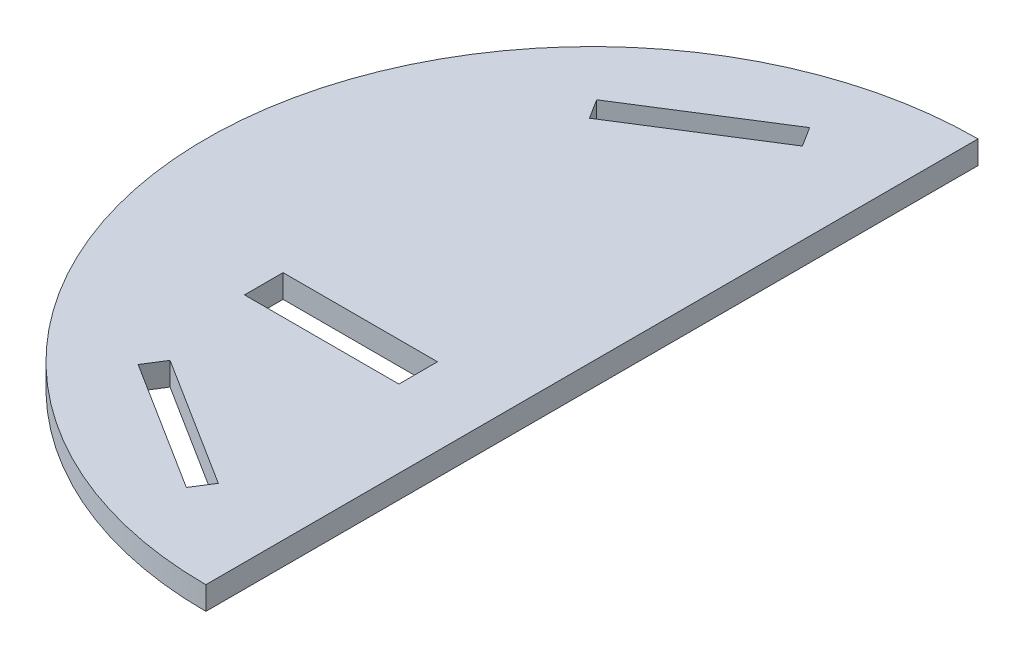
ISO-10303-21;
HEADER;
FILE_DESCRIPTION(('STEP AP214'),'2;1');
FILE_NAME('part.step','',(''),(''),'','','');
FILE_SCHEMA(('AUTOMOTIVE_DESIGN { 1 0 10303 214 1 1 1 1 }'));
ENDSEC;
DATA;
#1=APPLICATION_CONTEXT('core data for automotive mechanical design processes');
#2=APPLICATION_PROTOCOL_DEFINITION('international standard','automotive_design',2000,#1);
#3=PRODUCT_CONTEXT('',#1,'mechanical');
#4=PRODUCT('Part','Part','',(#3));
#5=PRODUCT_RELATED_PRODUCT_CATEGORY('part','',(#4));
#6=PRODUCT_DEFINITION_FORMATION('','',#4);
#7=PRODUCT_DEFINITION_CONTEXT('part definition',#1,'design');
#8=PRODUCT_DEFINITION('design','',#6,#7);
#9=PRODUCT_DEFINITION_SHAPE('','',#8);
#10=(LENGTH_UNIT() NAMED_UNIT(*) SI_UNIT(.MILLI.,.METRE.));
#11=(NAMED_UNIT(*) PLANE_ANGLE_UNIT() SI_UNIT($,.RADIAN.));
#12=(NAMED_UNIT(*) SI_UNIT($,.STERADIAN.) SOLID_ANGLE_UNIT());
#13=UNCERTAINTY_MEASURE_WITH_UNIT(LENGTH_MEASURE(1.E-05),#10,'distance_accuracy_value','');
#14=(GEOMETRIC_REPRESENTATION_CONTEXT(3) GLOBAL_UNCERTAINTY_ASSIGNED_CONTEXT((#13)) GLOBAL_UNIT_ASSIGNED_CONTEXT((#10,
#11,#12)) REPRESENTATION_CONTEXT('',''));
#15=CARTESIAN_POINT('',(0.,0.,0.));
#16=DIRECTION('',(0.,0.,1.));
#17=DIRECTION('',(1.,0.,0.));
#18=AXIS2_PLACEMENT_3D('',#15,#16,#17);
#19=CARTESIAN_POINT('',(0.,3.,0.));
#20=DIRECTION('',(0.,1.,0.));
#21=DIRECTION('',(0.,0.,1.));
#22=AXIS2_PLACEMENT_3D('',#19,#20,#21);
#23=PLANE('',#22);
#24=DIRECTION('',(0.845831324968348,0.,-0.533450437906175));
#25=VECTOR('',#24,1.);
#26=CARTESIAN_POINT('',(-20.0725494227989,3.,-31.826745030744));
#27=LINE('',#26,#25);
#28=CARTESIAN_POINT('',(-27.4795706485014,3.,-27.1552714168066));
#29=VERTEX_POINT('',#28);
#30=CARTESIAN_POINT('',(-10.5629441491344,3.,-37.8242801749302));
#31=VERTEX_POINT('',#30);
#32=EDGE_CURVE('E167',#29,#31,#27,.T.);
#33=ORIENTED_EDGE('',*,*,#32,.F.);
#34=DIRECTION('',(0.533450437906175,0.,0.845831324968348));
#35=VECTOR('',#34,1.);
#36=CARTESIAN_POINT('',(-7.40702122570254,3.,4.67147361393741));
#37=LINE('',#36,#35);
#38=CARTESIAN_POINT('',(-29.0799219622199,3.,-29.6927653917117));
#39=VERTEX_POINT('',#38);
#40=EDGE_CURVE('E176',#39,#29,#37,.T.);
#41=ORIENTED_EDGE('',*,*,#40,.F.);
#42=DIRECTION('',(0.845831324968348,0.,-0.533450437906175));
#43=VECTOR('',#42,1.);
#44=CARTESIAN_POINT('',(-21.6729007365174,3.,-34.3642390056491));
#45=LINE('',#44,#43);
#46=CARTESIAN_POINT('',(-12.163295462853,3.,-40.3617741498352));
#47=VERTEX_POINT('',#46);
#48=EDGE_CURVE('E173',#39,#47,#45,.T.);
#49=ORIENTED_EDGE('',*,*,#48,.T.);
#50=DIRECTION('',(-0.533450437906175,0.,-0.845831324968347));
#51=VECTOR('',#50,1.);
#52=CARTESIAN_POINT('',(9.50960527366441,3.,-5.9975351441861));
#53=LINE('',#52,#51);
#54=EDGE_CURVE('E169',#31,#47,#53,.T.);
#55=ORIENTED_EDGE('',*,*,#54,.F.);
#56=EDGE_LOOP('',(#33,#41,#49,#55));
#57=FACE_BOUND('',#56,.T.);
#58=DIRECTION('',(0.,0.,1.));
#59=VECTOR('',#58,1.);
#60=CARTESIAN_POINT('',(0.,3.,-50.));
#61=LINE('',#60,#59);
#62=CARTESIAN_POINT('',(0.,3.,-50.));
#63=VERTEX_POINT('',#62);
#64=CARTESIAN_POINT('',(0.,3.,50.));
#65=VERTEX_POINT('',#64);
#66=EDGE_CURVE('E208',#63,#65,#61,.T.);
#67=ORIENTED_EDGE('',*,*,#66,.F.);
#68=CARTESIAN_POINT('',(0.,3.,0.));
#69=DIRECTION('',(0.,1.,0.));
#70=DIRECTION('',(0.,0.,1.));
#71=AXIS2_PLACEMENT_3D('',#68,#69,#70);
#72=CIRCLE('',#71,50.);
#73=EDGE_CURVE('E211',#63,#65,#72,.T.);
#74=ORIENTED_EDGE('',*,*,#73,.T.);
#75=EDGE_LOOP('',(#67,#74));
#76=FACE_BOUND('',#75,.T.);
#77=DIRECTION('',(0.845831324968348,0.,0.533450437906175));
#78=VECTOR('',#77,1.);
#79=CARTESIAN_POINT('',(-21.6729007365174,3.,34.3642390056491));
#80=LINE('',#79,#78);
#81=CARTESIAN_POINT('',(-29.0799219622199,3.,29.6927653917117));
#82=VERTEX_POINT('',#81);
#83=CARTESIAN_POINT('',(-12.163295462853,3.,40.3617741498352));
#84=VERTEX_POINT('',#83);
#85=EDGE_CURVE('E191',#82,#84,#80,.T.);
#86=ORIENTED_EDGE('',*,*,#85,.F.);
#87=DIRECTION('',(0.533450437906175,0.,-0.845831324968348));
#88=VECTOR('',#87,1.);
#89=CARTESIAN_POINT('',(-7.40702122570255,3.,-4.67147361393741));
#90=LINE('',#89,#88);
#91=CARTESIAN_POINT('',(-27.4795706485014,3.,27.1552714168066));
#92=VERTEX_POINT('',#91);
#93=EDGE_CURVE('E164',#82,#92,#90,.T.);
#94=ORIENTED_EDGE('',*,*,#93,.T.);
#95=DIRECTION('',(0.845831324968347,0.,0.533450437906175));
#96=VECTOR('',#95,1.);
#97=CARTESIAN_POINT('',(-20.0725494227989,3.,31.826745030744));
#98=LINE('',#97,#96);
#99=CARTESIAN_POINT('',(-10.5629441491344,3.,37.8242801749301));
#100=VERTEX_POINT('',#99);
#101=EDGE_CURVE('E197',#92,#100,#98,.T.);
#102=ORIENTED_EDGE('',*,*,#101,.T.);
#103=DIRECTION('',(-0.533450437906175,0.,0.845831324968347));
#104=VECTOR('',#103,1.);
#105=CARTESIAN_POINT('',(9.50960527366441,3.,5.99753514418609));
#106=LINE('',#105,#104);
#107=EDGE_CURVE('E194',#100,#84,#106,.T.);
#108=ORIENTED_EDGE('',*,*,#107,.T.);
#109=EDGE_LOOP('',(#86,#94,#102,#108));
#110=FACE_BOUND('',#109,.T.);
#111=DIRECTION('',(0.,0.,1.));
#112=VECTOR('',#111,1.);
#113=CARTESIAN_POINT('',(-30.,3.,0.));
#114=LINE('',#113,#112);
#115=CARTESIAN_POINT('',(-30.,3.,10.));
#116=VERTEX_POINT('',#115);
#117=CARTESIAN_POINT('',(-30.,3.,15.));
#118=VERTEX_POINT('',#117);
#119=EDGE_CURVE('E152',#116,#118,#114,.T.);
#120=ORIENTED_EDGE('',*,*,#119,.F.);
#121=DIRECTION('',(1.,0.,0.));
#122=VECTOR('',#121,1.);
#123=CARTESIAN_POINT('',(0.,3.,10.));
#124=LINE('',#123,#122);
#125=CARTESIAN_POINT('',(-10.,3.,10.));
#126=VERTEX_POINT('',#125);
#127=EDGE_CURVE('E55',#116,#126,#124,.T.);
#128=ORIENTED_EDGE('',*,*,#127,.T.);
#129=DIRECTION('',(0.,0.,-1.));
#130=VECTOR('',#129,1.);
#131=CARTESIAN_POINT('',(-10.,3.,0.));
#132=LINE('',#131,#130);
#133=CARTESIAN_POINT('',(-10.,3.,15.));
#134=VERTEX_POINT('',#133);
#135=EDGE_CURVE('E157',#134,#126,#132,.T.);
#136=ORIENTED_EDGE('',*,*,#135,.F.);
#137=DIRECTION('',(1.,0.,0.));
#138=VECTOR('',#137,1.);
#139=CARTESIAN_POINT('',(0.,3.,15.));
#140=LINE('',#139,#138);
#141=EDGE_CURVE('E143',#118,#134,#140,.T.);
#142=ORIENTED_EDGE('',*,*,#141,.F.);
#143=EDGE_LOOP('',(#120,#128,#136,#142));
#144=FACE_BOUND('',#143,.T.);
#145=ADVANCED_FACE('F40',(#57,#76,#110,#144),#23,.T.);
#146=CARTESIAN_POINT('',(0.,0.,0.));
#147=DIRECTION('',(0.,1.,0.));
#148=DIRECTION('',(0.,0.,1.));
#149=AXIS2_PLACEMENT_3D('',#146,#147,#148);
#150=PLANE('',#149);
#151=DIRECTION('',(0.533450437906175,0.,-0.845831324968348));
#152=VECTOR('',#151,1.);
#153=CARTESIAN_POINT('',(-7.40702122570255,0.,-4.67147361393742));
#154=LINE('',#153,#152);
#155=CARTESIAN_POINT('',(-29.0799219622199,0.,29.6927653917117));
#156=VERTEX_POINT('',#155);
#157=CARTESIAN_POINT('',(-27.4795706485014,0.,27.1552714168066));
#158=VERTEX_POINT('',#157);
#159=EDGE_CURVE('E230',#156,#158,#154,.T.);
#160=ORIENTED_EDGE('',*,*,#159,.F.);
#161=DIRECTION('',(0.845831324968347,0.,0.533450437906175));
#162=VECTOR('',#161,1.);
#163=CARTESIAN_POINT('',(-21.6729007365174,0.,34.3642390056491));
#164=LINE('',#163,#162);
#165=CARTESIAN_POINT('',(-12.163295462853,0.,40.3617741498352));
#166=VERTEX_POINT('',#165);
#167=EDGE_CURVE('E221',#156,#166,#164,.T.);
#168=ORIENTED_EDGE('',*,*,#167,.T.);
#169=DIRECTION('',(-0.533450437906175,0.,0.845831324968347));
#170=VECTOR('',#169,1.);
#171=CARTESIAN_POINT('',(9.50960527366441,0.,5.99753514418609));
#172=LINE('',#171,#170);
#173=CARTESIAN_POINT('',(-10.5629441491344,0.,37.8242801749301));
#174=VERTEX_POINT('',#173);
#175=EDGE_CURVE('E225',#174,#166,#172,.T.);
#176=ORIENTED_EDGE('',*,*,#175,.F.);
#177=DIRECTION('',(0.845831324968347,0.,0.533450437906175));
#178=VECTOR('',#177,1.);
#179=CARTESIAN_POINT('',(-20.0725494227989,0.,31.826745030744));
#180=LINE('',#179,#178);
#181=EDGE_CURVE('E228',#158,#174,#180,.T.);
#182=ORIENTED_EDGE('',*,*,#181,.F.);
#183=EDGE_LOOP('',(#160,#168,#176,#182));
#184=FACE_BOUND('',#183,.T.);
#185=DIRECTION('',(0.,0.,1.));
#186=VECTOR('',#185,1.);
#187=CARTESIAN_POINT('',(0.,0.,-50.));
#188=LINE('',#187,#186);
#189=CARTESIAN_POINT('',(0.,0.,-50.));
#190=VERTEX_POINT('',#189);
#191=CARTESIAN_POINT('',(0.,0.,50.));
#192=VERTEX_POINT('',#191);
#193=EDGE_CURVE('E182',#190,#192,#188,.T.);
#194=ORIENTED_EDGE('',*,*,#193,.T.);
#195=CARTESIAN_POINT('',(0.,0.,0.));
#196=DIRECTION('',(0.,1.,0.));
#197=DIRECTION('',(0.,0.,1.));
#198=AXIS2_PLACEMENT_3D('',#195,#196,#197);
#199=CIRCLE('',#198,50.);
#200=EDGE_CURVE('E212',#190,#192,#199,.T.);
#201=ORIENTED_EDGE('',*,*,#200,.F.);
#202=EDGE_LOOP('',(#194,#201));
#203=FACE_BOUND('',#202,.T.);
#204=DIRECTION('',(0.533450437906175,0.,0.845831324968348));
#205=VECTOR('',#204,1.);
#206=CARTESIAN_POINT('',(-7.40702122570254,0.,4.67147361393742));
#207=LINE('',#206,#205);
#208=CARTESIAN_POINT('',(-29.0799219622199,0.,-29.6927653917117));
#209=VERTEX_POINT('',#208);
#210=CARTESIAN_POINT('',(-27.4795706485014,0.,-27.1552714168066));
#211=VERTEX_POINT('',#210);
#212=EDGE_CURVE('E238',#209,#211,#207,.T.);
#213=ORIENTED_EDGE('',*,*,#212,.T.);
#214=DIRECTION('',(0.845831324968347,0.,-0.533450437906175));
#215=VECTOR('',#214,1.);
#216=CARTESIAN_POINT('',(-20.0725494227989,0.,-31.8267450307441));
#217=LINE('',#216,#215);
#218=CARTESIAN_POINT('',(-10.5629441491344,0.,-37.8242801749302));
#219=VERTEX_POINT('',#218);
#220=EDGE_CURVE('E241',#211,#219,#217,.T.);
#221=ORIENTED_EDGE('',*,*,#220,.T.);
#222=DIRECTION('',(-0.533450437906175,0.,-0.845831324968347));
#223=VECTOR('',#222,1.);
#224=CARTESIAN_POINT('',(9.50960527366442,0.,-5.99753514418609));
#225=LINE('',#224,#223);
#226=CARTESIAN_POINT('',(-12.163295462853,0.,-40.3617741498352));
#227=VERTEX_POINT('',#226);
#228=EDGE_CURVE('E232',#219,#227,#225,.T.);
#229=ORIENTED_EDGE('',*,*,#228,.T.);
#230=DIRECTION('',(0.845831324968348,0.,-0.533450437906175));
#231=VECTOR('',#230,1.);
#232=CARTESIAN_POINT('',(-21.6729007365173,0.,-34.3642390056491));
#233=LINE('',#232,#231);
#234=EDGE_CURVE('E235',#209,#227,#233,.T.);
#235=ORIENTED_EDGE('',*,*,#234,.F.);
#236=EDGE_LOOP('',(#213,#221,#229,#235));
#237=FACE_BOUND('',#236,.T.);
#238=DIRECTION('',(1.,0.,0.));
#239=VECTOR('',#238,1.);
#240=CARTESIAN_POINT('',(0.,0.,10.));
#241=LINE('',#240,#239);
#242=CARTESIAN_POINT('',(-30.,0.,10.));
#243=VERTEX_POINT('',#242);
#244=CARTESIAN_POINT('',(-10.,0.,10.));
#245=VERTEX_POINT('',#244);
#246=EDGE_CURVE('E11',#243,#245,#241,.T.);
#247=ORIENTED_EDGE('',*,*,#246,.F.);
#248=DIRECTION('',(0.,0.,1.));
#249=VECTOR('',#248,1.);
#250=CARTESIAN_POINT('',(-30.,0.,0.));
#251=LINE('',#250,#249);
#252=CARTESIAN_POINT('',(-30.,0.,15.));
#253=VERTEX_POINT('',#252);
#254=EDGE_CURVE('E244',#243,#253,#251,.T.);
#255=ORIENTED_EDGE('',*,*,#254,.T.);
#256=DIRECTION('',(1.,0.,0.));
#257=VECTOR('',#256,1.);
#258=CARTESIAN_POINT('',(0.,0.,15.));
#259=LINE('',#258,#257);
#260=CARTESIAN_POINT('',(-10.,0.,15.));
#261=VERTEX_POINT('',#260);
#262=EDGE_CURVE('E146',#253,#261,#259,.T.);
#263=ORIENTED_EDGE('',*,*,#262,.T.);
#264=DIRECTION('',(0.,0.,-1.));
#265=VECTOR('',#264,1.);
#266=CARTESIAN_POINT('',(-10.,0.,0.));
#267=LINE('',#266,#265);
#268=EDGE_CURVE('E48',#261,#245,#267,.T.);
#269=ORIENTED_EDGE('',*,*,#268,.T.);
#270=EDGE_LOOP('',(#247,#255,#263,#269));
#271=FACE_BOUND('',#270,.T.);
#272=ADVANCED_FACE('F249',(#184,#203,#237,#271),#150,.F.);
#273=CARTESIAN_POINT('',(0.,3.,-50.));
#274=DIRECTION('',(1.,0.,0.));
#275=DIRECTION('',(0.,0.,-1.));
#276=AXIS2_PLACEMENT_3D('',#273,#274,#275);
#277=PLANE('',#276);
#278=ORIENTED_EDGE('',*,*,#193,.F.);
#279=DIRECTION('',(0.,-1.,0.));
#280=VECTOR('',#279,1.);
#281=CARTESIAN_POINT('',(0.,3.,-50.));
#282=LINE('',#281,#280);
#283=EDGE_CURVE('E219',#63,#190,#282,.T.);
#284=ORIENTED_EDGE('',*,*,#283,.F.);
#285=ORIENTED_EDGE('',*,*,#66,.T.);
#286=DIRECTION('',(0.,-1.,0.));
#287=VECTOR('',#286,1.);
#288=CARTESIAN_POINT('',(0.,3.,50.));
#289=LINE('',#288,#287);
#290=EDGE_CURVE('E214',#65,#192,#289,.T.);
#291=ORIENTED_EDGE('',*,*,#290,.T.);
#292=EDGE_LOOP('',(#278,#284,#285,#291));
#293=FACE_BOUND('',#292,.T.);
#294=ADVANCED_FACE('F42',(#293),#277,.T.);
#295=CARTESIAN_POINT('',(0.,3.,0.));
#296=DIRECTION('',(0.,-1.,0.));
#297=DIRECTION('',(0.,0.,-1.));
#298=AXIS2_PLACEMENT_3D('',#295,#296,#297);
#299=CYLINDRICAL_SURFACE('',#298,50.);
#300=ORIENTED_EDGE('',*,*,#200,.T.);
#301=ORIENTED_EDGE('',*,*,#290,.F.);
#302=ORIENTED_EDGE('',*,*,#73,.F.);
#303=ORIENTED_EDGE('',*,*,#283,.T.);
#304=EDGE_LOOP('',(#300,#301,#302,#303));
#305=FACE_BOUND('',#304,.T.);
#306=ADVANCED_FACE('F281',(#305),#299,.T.);
#307=CARTESIAN_POINT('',(-7.40702122570255,-2.,-4.67147361393741));
#308=DIRECTION('',(0.845831324968348,0.,0.533450437906175));
#309=DIRECTION('',(0.533450437906175,0.,-0.845831324968348));
#310=AXIS2_PLACEMENT_3D('',#307,#308,#309);
#311=PLANE('',#310);
#312=ORIENTED_EDGE('',*,*,#159,.T.);
#313=DIRECTION('',(0.,1.,0.));
#314=VECTOR('',#313,1.);
#315=CARTESIAN_POINT('',(-27.4795706485014,-2.,27.1552714168066));
#316=LINE('',#315,#314);
#317=EDGE_CURVE('E170',#158,#92,#316,.T.);
#318=ORIENTED_EDGE('',*,*,#317,.T.);
#319=ORIENTED_EDGE('',*,*,#93,.F.);
#320=DIRECTION('',(0.,1.,0.));
#321=VECTOR('',#320,1.);
#322=CARTESIAN_POINT('',(-29.0799219622199,-2.,29.6927653917117));
#323=LINE('',#322,#321);
#324=EDGE_CURVE('E200',#156,#82,#323,.T.);
#325=ORIENTED_EDGE('',*,*,#324,.F.);
#326=EDGE_LOOP('',(#312,#318,#319,#325));
#327=FACE_BOUND('',#326,.T.);
#328=ADVANCED_FACE('F279',(#327),#311,.T.);
#329=CARTESIAN_POINT('',(-20.0725494227989,-2.,31.826745030744));
#330=DIRECTION('',(-0.533450437906175,0.,0.845831324968347));
#331=DIRECTION('',(0.845831324968347,0.,0.533450437906175));
#332=AXIS2_PLACEMENT_3D('',#329,#330,#331);
#333=PLANE('',#332);
#334=ORIENTED_EDGE('',*,*,#181,.T.);
#335=DIRECTION('',(0.,1.,0.));
#336=VECTOR('',#335,1.);
#337=CARTESIAN_POINT('',(-10.5629441491344,-2.,37.8242801749301));
#338=LINE('',#337,#336);
#339=EDGE_CURVE('E202',#174,#100,#338,.T.);
#340=ORIENTED_EDGE('',*,*,#339,.T.);
#341=ORIENTED_EDGE('',*,*,#101,.F.);
#342=ORIENTED_EDGE('',*,*,#317,.F.);
#343=EDGE_LOOP('',(#334,#340,#341,#342));
#344=FACE_BOUND('',#343,.T.);
#345=ADVANCED_FACE('F289',(#344),#333,.T.);
#346=CARTESIAN_POINT('',(9.50960527366441,-2.,5.99753514418609));
#347=DIRECTION('',(-0.845831324968347,0.,-0.533450437906175));
#348=DIRECTION('',(-0.533450437906175,0.,0.845831324968347));
#349=AXIS2_PLACEMENT_3D('',#346,#347,#348);
#350=PLANE('',#349);
#351=ORIENTED_EDGE('',*,*,#175,.T.);
#352=DIRECTION('',(0.,1.,0.));
#353=VECTOR('',#352,1.);
#354=CARTESIAN_POINT('',(-12.163295462853,-2.,40.3617741498352));
#355=LINE('',#354,#353);
#356=EDGE_CURVE('E204',#166,#84,#355,.T.);
#357=ORIENTED_EDGE('',*,*,#356,.T.);
#358=ORIENTED_EDGE('',*,*,#107,.F.);
#359=ORIENTED_EDGE('',*,*,#339,.F.);
#360=EDGE_LOOP('',(#351,#357,#358,#359));
#361=FACE_BOUND('',#360,.T.);
#362=ADVANCED_FACE('F313',(#361),#350,.T.);
#363=CARTESIAN_POINT('',(-21.6729007365174,-2.,34.3642390056491));
#364=DIRECTION('',(-0.533450437906175,0.,0.845831324968347));
#365=DIRECTION('',(0.845831324968347,0.,0.533450437906175));
#366=AXIS2_PLACEMENT_3D('',#363,#364,#365);
#367=PLANE('',#366);
#368=ORIENTED_EDGE('',*,*,#324,.T.);
#369=ORIENTED_EDGE('',*,*,#85,.T.);
#370=ORIENTED_EDGE('',*,*,#356,.F.);
#371=ORIENTED_EDGE('',*,*,#167,.F.);
#372=EDGE_LOOP('',(#368,#369,#370,#371));
#373=FACE_BOUND('',#372,.T.);
#374=ADVANCED_FACE('F303',(#373),#367,.F.);
#375=CARTESIAN_POINT('',(-20.0725494227989,-2.,-31.826745030744));
#376=DIRECTION('',(0.533450437906175,0.,0.845831324968347));
#377=DIRECTION('',(0.845831324968347,0.,-0.533450437906175));
#378=AXIS2_PLACEMENT_3D('',#375,#376,#377);
#379=PLANE('',#378);
#380=DIRECTION('',(0.,1.,0.));
#381=VECTOR('',#380,1.);
#382=CARTESIAN_POINT('',(-27.4795706485014,-2.,-27.1552714168066));
#383=LINE('',#382,#381);
#384=EDGE_CURVE('E180',#211,#29,#383,.T.);
#385=ORIENTED_EDGE('',*,*,#384,.T.);
#386=ORIENTED_EDGE('',*,*,#32,.T.);
#387=DIRECTION('',(0.,1.,0.));
#388=VECTOR('',#387,1.);
#389=CARTESIAN_POINT('',(-10.5629441491344,-2.,-37.8242801749302));
#390=LINE('',#389,#388);
#391=EDGE_CURVE('E179',#219,#31,#390,.T.);
#392=ORIENTED_EDGE('',*,*,#391,.F.);
#393=ORIENTED_EDGE('',*,*,#220,.F.);
#394=EDGE_LOOP('',(#385,#386,#392,#393));
#395=FACE_BOUND('',#394,.T.);
#396=ADVANCED_FACE('F320',(#395),#379,.F.);
#397=CARTESIAN_POINT('',(-7.40702122570254,-2.,4.67147361393741));
#398=DIRECTION('',(-0.845831324968348,0.,0.533450437906175));
#399=DIRECTION('',(0.533450437906175,0.,0.845831324968348));
#400=AXIS2_PLACEMENT_3D('',#397,#398,#399);
#401=PLANE('',#400);
#402=DIRECTION('',(0.,1.,0.));
#403=VECTOR('',#402,1.);
#404=CARTESIAN_POINT('',(-29.0799219622199,-2.,-29.6927653917117));
#405=LINE('',#404,#403);
#406=EDGE_CURVE('E183',#209,#39,#405,.T.);
#407=ORIENTED_EDGE('',*,*,#406,.T.);
#408=ORIENTED_EDGE('',*,*,#40,.T.);
#409=ORIENTED_EDGE('',*,*,#384,.F.);
#410=ORIENTED_EDGE('',*,*,#212,.F.);
#411=EDGE_LOOP('',(#407,#408,#409,#410));
#412=FACE_BOUND('',#411,.T.);
#413=ADVANCED_FACE('F324',(#412),#401,.F.);
#414=CARTESIAN_POINT('',(-21.6729007365174,-2.,-34.3642390056491));
#415=DIRECTION('',(0.533450437906175,0.,0.845831324968348));
#416=DIRECTION('',(0.845831324968348,0.,-0.533450437906175));
#417=AXIS2_PLACEMENT_3D('',#414,#415,#416);
#418=PLANE('',#417);
#419=ORIENTED_EDGE('',*,*,#234,.T.);
#420=DIRECTION('',(0.,1.,0.));
#421=VECTOR('',#420,1.);
#422=CARTESIAN_POINT('',(-12.163295462853,-2.,-40.3617741498352));
#423=LINE('',#422,#421);
#424=EDGE_CURVE('E185',#227,#47,#423,.T.);
#425=ORIENTED_EDGE('',*,*,#424,.T.);
#426=ORIENTED_EDGE('',*,*,#48,.F.);
#427=ORIENTED_EDGE('',*,*,#406,.F.);
#428=EDGE_LOOP('',(#419,#425,#426,#427));
#429=FACE_BOUND('',#428,.T.);
#430=ADVANCED_FACE('F262',(#429),#418,.T.);
#431=CARTESIAN_POINT('',(9.50960527366441,-2.,-5.9975351441861));
#432=DIRECTION('',(0.845831324968347,0.,-0.533450437906175));
#433=DIRECTION('',(-0.533450437906175,0.,-0.845831324968347));
#434=AXIS2_PLACEMENT_3D('',#431,#432,#433);
#435=PLANE('',#434);
#436=ORIENTED_EDGE('',*,*,#391,.T.);
#437=ORIENTED_EDGE('',*,*,#54,.T.);
#438=ORIENTED_EDGE('',*,*,#424,.F.);
#439=ORIENTED_EDGE('',*,*,#228,.F.);
#440=EDGE_LOOP('',(#436,#437,#438,#439));
#441=FACE_BOUND('',#440,.T.);
#442=ADVANCED_FACE('F255',(#441),#435,.F.);
#443=CARTESIAN_POINT('',(0.,-2.,10.));
#444=DIRECTION('',(0.,0.,1.));
#445=DIRECTION('',(1.,0.,0.));
#446=AXIS2_PLACEMENT_3D('',#443,#444,#445);
#447=PLANE('',#446);
#448=ORIENTED_EDGE('',*,*,#246,.T.);
#449=DIRECTION('',(0.,1.,0.));
#450=VECTOR('',#449,1.);
#451=CARTESIAN_POINT('',(-10.,-2.,10.));
#452=LINE('',#451,#450);
#453=EDGE_CURVE('E162',#245,#126,#452,.T.);
#454=ORIENTED_EDGE('',*,*,#453,.T.);
#455=ORIENTED_EDGE('',*,*,#127,.F.);
#456=DIRECTION('',(0.,1.,0.));
#457=VECTOR('',#456,1.);
#458=CARTESIAN_POINT('',(-30.,-2.,10.));
#459=LINE('',#458,#457);
#460=EDGE_CURVE('E149',#243,#116,#459,.T.);
#461=ORIENTED_EDGE('',*,*,#460,.F.);
#462=EDGE_LOOP('',(#448,#454,#455,#461));
#463=FACE_BOUND('',#462,.T.);
#464=ADVANCED_FACE('F253',(#463),#447,.T.);
#465=CARTESIAN_POINT('',(-10.,-2.,0.));
#466=DIRECTION('',(1.,0.,0.));
#467=DIRECTION('',(0.,0.,-1.));
#468=AXIS2_PLACEMENT_3D('',#465,#466,#467);
#469=PLANE('',#468);
#470=DIRECTION('',(0.,1.,0.));
#471=VECTOR('',#470,1.);
#472=CARTESIAN_POINT('',(-10.,-2.,15.));
#473=LINE('',#472,#471);
#474=EDGE_CURVE('E148',#261,#134,#473,.T.);
#475=ORIENTED_EDGE('',*,*,#474,.T.);
#476=ORIENTED_EDGE('',*,*,#135,.T.);
#477=ORIENTED_EDGE('',*,*,#453,.F.);
#478=ORIENTED_EDGE('',*,*,#268,.F.);
#479=EDGE_LOOP('',(#475,#476,#477,#478));
#480=FACE_BOUND('',#479,.T.);
#481=ADVANCED_FACE('F252',(#480),#469,.F.);
#482=CARTESIAN_POINT('',(0.,-2.,15.));
#483=DIRECTION('',(0.,0.,1.));
#484=DIRECTION('',(1.,0.,0.));
#485=AXIS2_PLACEMENT_3D('',#482,#483,#484);
#486=PLANE('',#485);
#487=DIRECTION('',(0.,1.,0.));
#488=VECTOR('',#487,1.);
#489=CARTESIAN_POINT('',(-30.,-2.,15.));
#490=LINE('',#489,#488);
#491=EDGE_CURVE('E63',#253,#118,#490,.T.);
#492=ORIENTED_EDGE('',*,*,#491,.T.);
#493=ORIENTED_EDGE('',*,*,#141,.T.);
#494=ORIENTED_EDGE('',*,*,#474,.F.);
#495=ORIENTED_EDGE('',*,*,#262,.F.);
#496=EDGE_LOOP('',(#492,#493,#494,#495));
#497=FACE_BOUND('',#496,.T.);
#498=ADVANCED_FACE('F140',(#497),#486,.F.);
#499=CARTESIAN_POINT('',(-30.,-2.,0.));
#500=DIRECTION('',(-1.,0.,0.));
#501=DIRECTION('',(0.,0.,1.));
#502=AXIS2_PLACEMENT_3D('',#499,#500,#501);
#503=PLANE('',#502);
#504=ORIENTED_EDGE('',*,*,#460,.T.);
#505=ORIENTED_EDGE('',*,*,#119,.T.);
#506=ORIENTED_EDGE('',*,*,#491,.F.);
#507=ORIENTED_EDGE('',*,*,#254,.F.);
#508=EDGE_LOOP('',(#504,#505,#506,#507));
#509=FACE_BOUND('',#508,.T.);
#510=ADVANCED_FACE('F153',(#509),#503,.F.);
#511=CLOSED_SHELL('',(#145,#272,#294,#306,#328,#345,#362,#374,#396,#413,#430,#442,#464,#481,
#498,#510));
#512=MANIFOLD_SOLID_BREP('B2',#511);
#513=ADVANCED_BREP_SHAPE_REPRESENTATION('',(#18,#512),#14);
#514=SHAPE_DEFINITION_REPRESENTATION(#9,#513);
ENDSEC;
END-ISO-10303-21;
